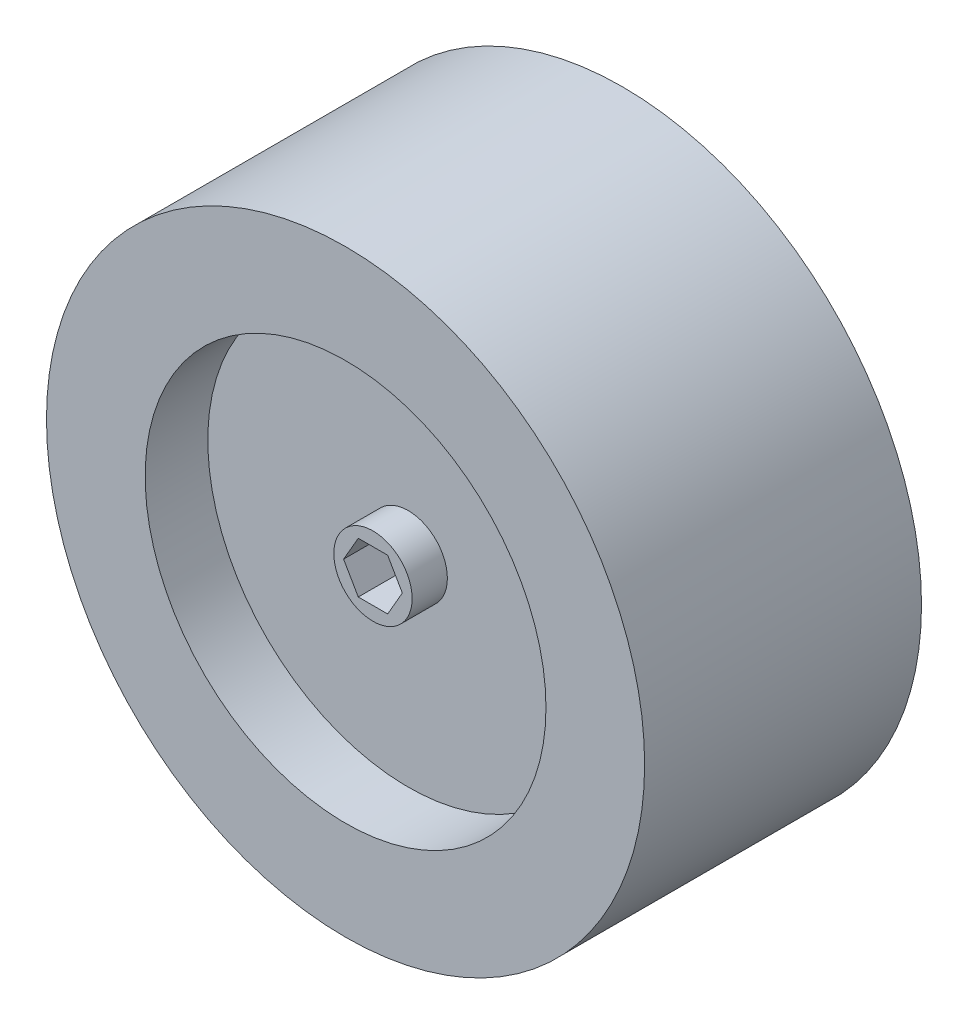
ISO-10303-21;
HEADER;
FILE_DESCRIPTION(('STEP AP214'),'2;1');
FILE_NAME('part.step','',(''),(''),'','','');
FILE_SCHEMA(('AUTOMOTIVE_DESIGN { 1 0 10303 214 1 1 1 1 }'));
ENDSEC;
DATA;
#1=APPLICATION_CONTEXT('core data for automotive mechanical design processes');
#2=APPLICATION_PROTOCOL_DEFINITION('international standard','automotive_design',2000,#1);
#3=PRODUCT_CONTEXT('',#1,'mechanical');
#4=PRODUCT('Part','Part','',(#3));
#5=PRODUCT_RELATED_PRODUCT_CATEGORY('part','',(#4));
#6=PRODUCT_DEFINITION_FORMATION('','',#4);
#7=PRODUCT_DEFINITION_CONTEXT('part definition',#1,'design');
#8=PRODUCT_DEFINITION('design','',#6,#7);
#9=PRODUCT_DEFINITION_SHAPE('','',#8);
#10=(LENGTH_UNIT() NAMED_UNIT(*) SI_UNIT(.MILLI.,.METRE.));
#11=(NAMED_UNIT(*) PLANE_ANGLE_UNIT() SI_UNIT($,.RADIAN.));
#12=(NAMED_UNIT(*) SI_UNIT($,.STERADIAN.) SOLID_ANGLE_UNIT());
#13=UNCERTAINTY_MEASURE_WITH_UNIT(LENGTH_MEASURE(1.E-05),#10,'distance_accuracy_value','');
#14=(GEOMETRIC_REPRESENTATION_CONTEXT(3) GLOBAL_UNCERTAINTY_ASSIGNED_CONTEXT((#13)) GLOBAL_UNIT_ASSIGNED_CONTEXT((#10,
#11,#12)) REPRESENTATION_CONTEXT('',''));
#15=CARTESIAN_POINT('',(0.,0.,0.));
#16=DIRECTION('',(0.,0.,1.));
#17=DIRECTION('',(1.,0.,0.));
#18=AXIS2_PLACEMENT_3D('',#15,#16,#17);
#19=CARTESIAN_POINT('',(0.,0.,-14.195));
#20=DIRECTION('',(0.,0.,-1.));
#21=DIRECTION('',(-1.,0.,0.));
#22=AXIS2_PLACEMENT_3D('',#19,#20,#21);
#23=CYLINDRICAL_SURFACE('',#22,3.81);
#24=CARTESIAN_POINT('',(0.,0.,-14.195));
#25=DIRECTION('',(0.,0.,-1.));
#26=DIRECTION('',(-1.,0.,0.));
#27=AXIS2_PLACEMENT_3D('',#24,#25,#26);
#28=CIRCLE('',#27,3.81);
#29=CARTESIAN_POINT('',(-3.81,0.,-14.195));
#30=VERTEX_POINT('',#29);
#31=EDGE_CURVE('E197',#30,#30,#28,.T.);
#32=ORIENTED_EDGE('',*,*,#31,.F.);
#33=EDGE_LOOP('',(#32));
#34=FACE_BOUND('',#33,.T.);
#35=CARTESIAN_POINT('',(0.,0.,-19.275));
#36=DIRECTION('',(0.,0.,-1.));
#37=DIRECTION('',(-1.,0.,0.));
#38=AXIS2_PLACEMENT_3D('',#35,#36,#37);
#39=CIRCLE('',#38,3.81);
#40=CARTESIAN_POINT('',(-3.81,0.,-19.275));
#41=VERTEX_POINT('',#40);
#42=EDGE_CURVE('E47',#41,#41,#39,.F.);
#43=ORIENTED_EDGE('',*,*,#42,.F.);
#44=EDGE_LOOP('',(#43));
#45=FACE_BOUND('',#44,.T.);
#46=ADVANCED_FACE('F43',(#34,#45),#23,.F.);
#47=CARTESIAN_POINT('',(0.,0.,-9.81));
#48=DIRECTION('',(0.,0.,1.));
#49=DIRECTION('',(1.,0.,0.));
#50=AXIS2_PLACEMENT_3D('',#47,#48,#49);
#51=CYLINDRICAL_SURFACE('',#50,2.75);
#52=CARTESIAN_POINT('',(0.,0.,-9.835));
#53=DIRECTION('',(0.,0.,1.));
#54=DIRECTION('',(1.,0.,0.));
#55=AXIS2_PLACEMENT_3D('',#52,#53,#54);
#56=CIRCLE('',#55,2.75);
#57=CARTESIAN_POINT('',(2.75,0.,-9.835));
#58=VERTEX_POINT('',#57);
#59=EDGE_CURVE('E122',#58,#58,#56,.T.);
#60=ORIENTED_EDGE('',*,*,#59,.T.);
#61=EDGE_LOOP('',(#60));
#62=FACE_BOUND('',#61,.T.);
#63=CARTESIAN_POINT('',(0.,0.,-14.195));
#64=DIRECTION('',(0.,0.,-1.));
#65=DIRECTION('',(-1.,0.,0.));
#66=AXIS2_PLACEMENT_3D('',#63,#64,#65);
#67=CIRCLE('',#66,2.75);
#68=CARTESIAN_POINT('',(-2.75,0.,-14.195));
#69=VERTEX_POINT('',#68);
#70=EDGE_CURVE('E194',#69,#69,#67,.F.);
#71=ORIENTED_EDGE('',*,*,#70,.F.);
#72=EDGE_LOOP('',(#71));
#73=FACE_BOUND('',#72,.T.);
#74=ADVANCED_FACE('F244',(#62,#73),#51,.F.);
#75=CARTESIAN_POINT('',(0.,0.,18.005));
#76=DIRECTION('',(0.,0.,1.));
#77=DIRECTION('',(1.,0.,0.));
#78=AXIS2_PLACEMENT_3D('',#75,#76,#77);
#79=PLANE('',#78);
#80=CARTESIAN_POINT('',(0.,0.,18.005));
#81=DIRECTION('',(0.,0.,1.));
#82=DIRECTION('',(1.,0.,0.));
#83=AXIS2_PLACEMENT_3D('',#80,#81,#82);
#84=CIRCLE('',#83,6.35);
#85=CARTESIAN_POINT('',(6.35,0.,18.005));
#86=VERTEX_POINT('',#85);
#87=EDGE_CURVE('E154',#86,#86,#84,.T.);
#88=ORIENTED_EDGE('',*,*,#87,.T.);
#89=EDGE_LOOP('',(#88));
#90=FACE_BOUND('',#89,.T.);
#91=DIRECTION('',(1.,0.,0.));
#92=VECTOR('',#91,1.);
#93=CARTESIAN_POINT('',(0.,4.125,18.005));
#94=LINE('',#93,#92);
#95=CARTESIAN_POINT('',(-2.38156986040721,4.125,18.005));
#96=VERTEX_POINT('',#95);
#97=CARTESIAN_POINT('',(2.3815698604072,4.125,18.005));
#98=VERTEX_POINT('',#97);
#99=EDGE_CURVE('E53',#96,#98,#94,.T.);
#100=ORIENTED_EDGE('',*,*,#99,.T.);
#101=DIRECTION('',(0.5,-0.866025403784439,0.));
#102=VECTOR('',#101,1.);
#103=CARTESIAN_POINT('',(3.57235479061081,2.0625,18.005));
#104=LINE('',#103,#102);
#105=CARTESIAN_POINT('',(4.76313972081441,0.,18.005));
#106=VERTEX_POINT('',#105);
#107=EDGE_CURVE('E11',#98,#106,#104,.T.);
#108=ORIENTED_EDGE('',*,*,#107,.T.);
#109=DIRECTION('',(-0.5,-0.866025403784439,0.));
#110=VECTOR('',#109,1.);
#111=CARTESIAN_POINT('',(3.57235479061081,-2.0625,18.005));
#112=LINE('',#111,#110);
#113=CARTESIAN_POINT('',(2.3815698604072,-4.125,18.005));
#114=VERTEX_POINT('',#113);
#115=EDGE_CURVE('E174',#106,#114,#112,.T.);
#116=ORIENTED_EDGE('',*,*,#115,.T.);
#117=DIRECTION('',(-1.,0.,0.));
#118=VECTOR('',#117,1.);
#119=CARTESIAN_POINT('',(0.,-4.125,18.005));
#120=LINE('',#119,#118);
#121=CARTESIAN_POINT('',(-2.38156986040721,-4.125,18.005));
#122=VERTEX_POINT('',#121);
#123=EDGE_CURVE('E181',#114,#122,#120,.T.);
#124=ORIENTED_EDGE('',*,*,#123,.T.);
#125=DIRECTION('',(-0.5,0.866025403784439,0.));
#126=VECTOR('',#125,1.);
#127=CARTESIAN_POINT('',(-3.57235479061081,-2.0625,18.005));
#128=LINE('',#127,#126);
#129=CARTESIAN_POINT('',(-4.76313972081441,0.,18.005));
#130=VERTEX_POINT('',#129);
#131=EDGE_CURVE('E185',#122,#130,#128,.T.);
#132=ORIENTED_EDGE('',*,*,#131,.T.);
#133=DIRECTION('',(0.5,0.866025403784439,0.));
#134=VECTOR('',#133,1.);
#135=CARTESIAN_POINT('',(-3.57235479061081,2.0625,18.005));
#136=LINE('',#135,#134);
#137=EDGE_CURVE('E189',#130,#96,#136,.T.);
#138=ORIENTED_EDGE('',*,*,#137,.T.);
#139=EDGE_LOOP('',(#100,#108,#116,#124,#132,#138));
#140=FACE_BOUND('',#139,.T.);
#141=ADVANCED_FACE('F236',(#90,#140),#79,.T.);
#142=CARTESIAN_POINT('',(0.,0.,22.45));
#143=DIRECTION('',(0.,0.,-1.));
#144=DIRECTION('',(-1.,0.,0.));
#145=AXIS2_PLACEMENT_3D('',#142,#143,#144);
#146=CYLINDRICAL_SURFACE('',#145,48.5);
#147=CARTESIAN_POINT('',(0.,0.,22.45));
#148=DIRECTION('',(0.,0.,1.));
#149=DIRECTION('',(1.,0.,0.));
#150=AXIS2_PLACEMENT_3D('',#147,#148,#149);
#151=CIRCLE('',#150,48.5);
#152=CARTESIAN_POINT('',(48.5,0.,22.45));
#153=VERTEX_POINT('',#152);
#154=EDGE_CURVE('E170',#153,#153,#151,.T.);
#155=ORIENTED_EDGE('',*,*,#154,.F.);
#156=EDGE_LOOP('',(#155));
#157=FACE_BOUND('',#156,.T.);
#158=CARTESIAN_POINT('',(0.,0.,-22.45));
#159=DIRECTION('',(0.,0.,1.));
#160=DIRECTION('',(1.,0.,0.));
#161=AXIS2_PLACEMENT_3D('',#158,#159,#160);
#162=CIRCLE('',#161,48.5);
#163=CARTESIAN_POINT('',(48.5,0.,-22.45));
#164=VERTEX_POINT('',#163);
#165=EDGE_CURVE('E166',#164,#164,#162,.T.);
#166=ORIENTED_EDGE('',*,*,#165,.T.);
#167=EDGE_LOOP('',(#166));
#168=FACE_BOUND('',#167,.T.);
#169=ADVANCED_FACE('F45',(#157,#168),#146,.T.);
#170=CARTESIAN_POINT('',(0.,0.,22.45));
#171=DIRECTION('',(0.,0.,1.));
#172=DIRECTION('',(1.,0.,0.));
#173=AXIS2_PLACEMENT_3D('',#170,#171,#172);
#174=PLANE('',#173);
#175=CARTESIAN_POINT('',(0.,0.,22.45));
#176=DIRECTION('',(0.,0.,1.));
#177=DIRECTION('',(1.,0.,0.));
#178=AXIS2_PLACEMENT_3D('',#175,#176,#177);
#179=CIRCLE('',#178,32.5);
#180=CARTESIAN_POINT('',(32.5,0.,22.45));
#181=VERTEX_POINT('',#180);
#182=EDGE_CURVE('E158',#181,#181,#179,.T.);
#183=ORIENTED_EDGE('',*,*,#182,.F.);
#184=EDGE_LOOP('',(#183));
#185=FACE_BOUND('',#184,.T.);
#186=ORIENTED_EDGE('',*,*,#154,.T.);
#187=EDGE_LOOP('',(#186));
#188=FACE_BOUND('',#187,.T.);
#189=ADVANCED_FACE('F232',(#185,#188),#174,.T.);
#190=CARTESIAN_POINT('',(0.,0.,-22.45));
#191=DIRECTION('',(0.,0.,1.));
#192=DIRECTION('',(1.,0.,0.));
#193=AXIS2_PLACEMENT_3D('',#190,#191,#192);
#194=PLANE('',#193);
#195=CARTESIAN_POINT('',(0.,0.,-22.45));
#196=DIRECTION('',(0.,0.,-1.));
#197=DIRECTION('',(-1.,0.,0.));
#198=AXIS2_PLACEMENT_3D('',#195,#196,#197);
#199=CIRCLE('',#198,25.4);
#200=CARTESIAN_POINT('',(-25.4,0.,-22.45));
#201=VERTEX_POINT('',#200);
#202=EDGE_CURVE('E211',#201,#201,#199,.T.);
#203=ORIENTED_EDGE('',*,*,#202,.F.);
#204=EDGE_LOOP('',(#203));
#205=FACE_BOUND('',#204,.T.);
#206=ORIENTED_EDGE('',*,*,#165,.F.);
#207=EDGE_LOOP('',(#206));
#208=FACE_BOUND('',#207,.T.);
#209=ADVANCED_FACE('F228',(#205,#208),#194,.F.);
#210=CARTESIAN_POINT('',(0.,0.,12.29));
#211=DIRECTION('',(0.,0.,1.));
#212=DIRECTION('',(1.,0.,0.));
#213=AXIS2_PLACEMENT_3D('',#210,#211,#212);
#214=CYLINDRICAL_SURFACE('',#213,32.5);
#215=CARTESIAN_POINT('',(0.,0.,12.29));
#216=DIRECTION('',(0.,0.,1.));
#217=DIRECTION('',(1.,0.,0.));
#218=AXIS2_PLACEMENT_3D('',#215,#216,#217);
#219=CIRCLE('',#218,32.5);
#220=CARTESIAN_POINT('',(32.5,0.,12.29));
#221=VERTEX_POINT('',#220);
#222=EDGE_CURVE('E162',#221,#221,#219,.T.);
#223=ORIENTED_EDGE('',*,*,#222,.F.);
#224=EDGE_LOOP('',(#223));
#225=FACE_BOUND('',#224,.T.);
#226=ORIENTED_EDGE('',*,*,#182,.T.);
#227=EDGE_LOOP('',(#226));
#228=FACE_BOUND('',#227,.T.);
#229=ADVANCED_FACE('F231',(#225,#228),#214,.F.);
#230=CARTESIAN_POINT('',(0.,0.,12.29));
#231=DIRECTION('',(0.,0.,1.));
#232=DIRECTION('',(1.,0.,0.));
#233=AXIS2_PLACEMENT_3D('',#230,#231,#232);
#234=PLANE('',#233);
#235=CARTESIAN_POINT('',(0.,0.,12.29));
#236=DIRECTION('',(0.,0.,1.));
#237=DIRECTION('',(1.,0.,0.));
#238=AXIS2_PLACEMENT_3D('',#235,#236,#237);
#239=CIRCLE('',#238,6.35);
#240=CARTESIAN_POINT('',(6.35,0.,12.29));
#241=VERTEX_POINT('',#240);
#242=EDGE_CURVE('E105',#241,#241,#239,.T.);
#243=ORIENTED_EDGE('',*,*,#242,.F.);
#244=EDGE_LOOP('',(#243));
#245=FACE_BOUND('',#244,.T.);
#246=ORIENTED_EDGE('',*,*,#222,.T.);
#247=EDGE_LOOP('',(#246));
#248=FACE_BOUND('',#247,.T.);
#249=ADVANCED_FACE('F289',(#245,#248),#234,.T.);
#250=CARTESIAN_POINT('',(0.,0.,18.005));
#251=DIRECTION('',(0.,0.,-1.));
#252=DIRECTION('',(-1.,0.,0.));
#253=AXIS2_PLACEMENT_3D('',#250,#251,#252);
#254=CYLINDRICAL_SURFACE('',#253,6.35);
#255=ORIENTED_EDGE('',*,*,#87,.F.);
#256=EDGE_LOOP('',(#255));
#257=FACE_BOUND('',#256,.T.);
#258=ORIENTED_EDGE('',*,*,#242,.T.);
#259=EDGE_LOOP('',(#258));
#260=FACE_BOUND('',#259,.T.);
#261=ADVANCED_FACE('F285',(#257,#260),#254,.T.);
#262=CARTESIAN_POINT('',(4.76313972081441,0.,22.45));
#263=DIRECTION('',(-0.866025403784438,-0.5,0.));
#264=DIRECTION('',(0.5,-0.866025403784439,0.));
#265=AXIS2_PLACEMENT_3D('',#262,#263,#264);
#266=PLANE('',#265);
#267=DIRECTION('',(0.,0.,-1.));
#268=VECTOR('',#267,1.);
#269=CARTESIAN_POINT('',(2.3815698604072,4.125,22.45));
#270=LINE('',#269,#268);
#271=CARTESIAN_POINT('',(2.3815698604072,4.125,-9.81));
#272=VERTEX_POINT('',#271);
#273=EDGE_CURVE('E96',#98,#272,#270,.T.);
#274=ORIENTED_EDGE('',*,*,#273,.T.);
#275=DIRECTION('',(-0.5,0.866025403784439,0.));
#276=VECTOR('',#275,1.);
#277=CARTESIAN_POINT('',(4.76313972081441,0.,-9.81));
#278=LINE('',#277,#276);
#279=CARTESIAN_POINT('',(4.76313972081441,0.,-9.81));
#280=VERTEX_POINT('',#279);
#281=EDGE_CURVE('E100',#280,#272,#278,.T.);
#282=ORIENTED_EDGE('',*,*,#281,.F.);
#283=DIRECTION('',(0.,0.,-1.));
#284=VECTOR('',#283,1.);
#285=CARTESIAN_POINT('',(4.76313972081441,0.,22.45));
#286=LINE('',#285,#284);
#287=EDGE_CURVE('E141',#106,#280,#286,.T.);
#288=ORIENTED_EDGE('',*,*,#287,.F.);
#289=ORIENTED_EDGE('',*,*,#107,.F.);
#290=EDGE_LOOP('',(#274,#282,#288,#289));
#291=FACE_BOUND('',#290,.T.);
#292=ADVANCED_FACE('F98',(#291),#266,.T.);
#293=CARTESIAN_POINT('',(2.3815698604072,4.125,22.45));
#294=DIRECTION('',(0.,-1.,0.));
#295=DIRECTION('',(1.,0.,0.));
#296=AXIS2_PLACEMENT_3D('',#293,#294,#295);
#297=PLANE('',#296);
#298=DIRECTION('',(0.,0.,-1.));
#299=VECTOR('',#298,1.);
#300=CARTESIAN_POINT('',(-2.38156986040721,4.125,22.45));
#301=LINE('',#300,#299);
#302=CARTESIAN_POINT('',(-2.38156986040721,4.125,-9.81));
#303=VERTEX_POINT('',#302);
#304=EDGE_CURVE('E106',#96,#303,#301,.T.);
#305=ORIENTED_EDGE('',*,*,#304,.T.);
#306=DIRECTION('',(-1.,0.,0.));
#307=VECTOR('',#306,1.);
#308=CARTESIAN_POINT('',(2.3815698604072,4.125,-9.81));
#309=LINE('',#308,#307);
#310=EDGE_CURVE('E109',#272,#303,#309,.T.);
#311=ORIENTED_EDGE('',*,*,#310,.F.);
#312=ORIENTED_EDGE('',*,*,#273,.F.);
#313=ORIENTED_EDGE('',*,*,#99,.F.);
#314=EDGE_LOOP('',(#305,#311,#312,#313));
#315=FACE_BOUND('',#314,.T.);
#316=ADVANCED_FACE('F110',(#315),#297,.T.);
#317=CARTESIAN_POINT('',(-2.38156986040721,4.125,22.45));
#318=DIRECTION('',(0.866025403784439,-0.5,0.));
#319=DIRECTION('',(0.5,0.866025403784439,0.));
#320=AXIS2_PLACEMENT_3D('',#317,#318,#319);
#321=PLANE('',#320);
#322=DIRECTION('',(0.,0.,-1.));
#323=VECTOR('',#322,1.);
#324=CARTESIAN_POINT('',(-4.76313972081441,0.,22.45));
#325=LINE('',#324,#323);
#326=CARTESIAN_POINT('',(-4.76313972081441,0.,-9.81));
#327=VERTEX_POINT('',#326);
#328=EDGE_CURVE('E149',#130,#327,#325,.T.);
#329=ORIENTED_EDGE('',*,*,#328,.T.);
#330=DIRECTION('',(-0.5,-0.866025403784439,0.));
#331=VECTOR('',#330,1.);
#332=CARTESIAN_POINT('',(-2.38156986040721,4.125,-9.81));
#333=LINE('',#332,#331);
#334=EDGE_CURVE('E116',#303,#327,#333,.T.);
#335=ORIENTED_EDGE('',*,*,#334,.F.);
#336=ORIENTED_EDGE('',*,*,#304,.F.);
#337=ORIENTED_EDGE('',*,*,#137,.F.);
#338=EDGE_LOOP('',(#329,#335,#336,#337));
#339=FACE_BOUND('',#338,.T.);
#340=ADVANCED_FACE('F277',(#339),#321,.T.);
#341=CARTESIAN_POINT('',(-4.76313972081441,0.,22.45));
#342=DIRECTION('',(0.866025403784439,0.5,0.));
#343=DIRECTION('',(-0.5,0.866025403784439,0.));
#344=AXIS2_PLACEMENT_3D('',#341,#342,#343);
#345=PLANE('',#344);
#346=DIRECTION('',(0.,0.,-1.));
#347=VECTOR('',#346,1.);
#348=CARTESIAN_POINT('',(-2.38156986040721,-4.125,22.45));
#349=LINE('',#348,#347);
#350=CARTESIAN_POINT('',(-2.38156986040721,-4.125,-9.81));
#351=VERTEX_POINT('',#350);
#352=EDGE_CURVE('E146',#122,#351,#349,.T.);
#353=ORIENTED_EDGE('',*,*,#352,.T.);
#354=DIRECTION('',(0.5,-0.866025403784439,0.));
#355=VECTOR('',#354,1.);
#356=CARTESIAN_POINT('',(-4.76313972081441,0.,-9.81));
#357=LINE('',#356,#355);
#358=EDGE_CURVE('E132',#327,#351,#357,.T.);
#359=ORIENTED_EDGE('',*,*,#358,.F.);
#360=ORIENTED_EDGE('',*,*,#328,.F.);
#361=ORIENTED_EDGE('',*,*,#131,.F.);
#362=EDGE_LOOP('',(#353,#359,#360,#361));
#363=FACE_BOUND('',#362,.T.);
#364=ADVANCED_FACE('F273',(#363),#345,.T.);
#365=CARTESIAN_POINT('',(-2.38156986040721,-4.125,22.45));
#366=DIRECTION('',(0.,1.,0.));
#367=DIRECTION('',(0.,0.,1.));
#368=AXIS2_PLACEMENT_3D('',#365,#366,#367);
#369=PLANE('',#368);
#370=DIRECTION('',(0.,0.,-1.));
#371=VECTOR('',#370,1.);
#372=CARTESIAN_POINT('',(2.3815698604072,-4.125,22.45));
#373=LINE('',#372,#371);
#374=CARTESIAN_POINT('',(2.3815698604072,-4.125,-9.81));
#375=VERTEX_POINT('',#374);
#376=EDGE_CURVE('E61',#114,#375,#373,.T.);
#377=ORIENTED_EDGE('',*,*,#376,.T.);
#378=DIRECTION('',(1.,0.,0.));
#379=VECTOR('',#378,1.);
#380=CARTESIAN_POINT('',(-2.38156986040721,-4.125,-9.81));
#381=LINE('',#380,#379);
#382=EDGE_CURVE('E136',#351,#375,#381,.T.);
#383=ORIENTED_EDGE('',*,*,#382,.F.);
#384=ORIENTED_EDGE('',*,*,#352,.F.);
#385=ORIENTED_EDGE('',*,*,#123,.F.);
#386=EDGE_LOOP('',(#377,#383,#384,#385));
#387=FACE_BOUND('',#386,.T.);
#388=ADVANCED_FACE('F270',(#387),#369,.T.);
#389=CARTESIAN_POINT('',(2.3815698604072,-4.125,22.45));
#390=DIRECTION('',(-0.866025403784439,0.5,0.));
#391=DIRECTION('',(-0.5,-0.866025403784439,0.));
#392=AXIS2_PLACEMENT_3D('',#389,#390,#391);
#393=PLANE('',#392);
#394=ORIENTED_EDGE('',*,*,#287,.T.);
#395=DIRECTION('',(0.5,0.866025403784439,0.));
#396=VECTOR('',#395,1.);
#397=CARTESIAN_POINT('',(2.3815698604072,-4.125,-9.81));
#398=LINE('',#397,#396);
#399=EDGE_CURVE('E120',#375,#280,#398,.T.);
#400=ORIENTED_EDGE('',*,*,#399,.F.);
#401=ORIENTED_EDGE('',*,*,#376,.F.);
#402=ORIENTED_EDGE('',*,*,#115,.F.);
#403=EDGE_LOOP('',(#394,#400,#401,#402));
#404=FACE_BOUND('',#403,.T.);
#405=ADVANCED_FACE('F266',(#404),#393,.T.);
#406=CARTESIAN_POINT('',(0.,0.,-9.81));
#407=DIRECTION('',(0.,0.,1.));
#408=DIRECTION('',(1.,0.,0.));
#409=AXIS2_PLACEMENT_3D('',#406,#407,#408);
#410=PLANE('',#409);
#411=CARTESIAN_POINT('',(0.,0.,-9.81));
#412=DIRECTION('',(0.,0.,1.));
#413=DIRECTION('',(1.,0.,0.));
#414=AXIS2_PLACEMENT_3D('',#411,#412,#413);
#415=CIRCLE('',#414,2.775);
#416=CARTESIAN_POINT('',(2.775,0.,-9.81));
#417=VERTEX_POINT('',#416);
#418=EDGE_CURVE('E126',#417,#417,#415,.T.);
#419=ORIENTED_EDGE('',*,*,#418,.F.);
#420=EDGE_LOOP('',(#419));
#421=FACE_BOUND('',#420,.T.);
#422=ORIENTED_EDGE('',*,*,#281,.T.);
#423=ORIENTED_EDGE('',*,*,#310,.T.);
#424=ORIENTED_EDGE('',*,*,#334,.T.);
#425=ORIENTED_EDGE('',*,*,#358,.T.);
#426=ORIENTED_EDGE('',*,*,#382,.T.);
#427=ORIENTED_EDGE('',*,*,#399,.T.);
#428=EDGE_LOOP('',(#422,#423,#424,#425,#426,#427));
#429=FACE_BOUND('',#428,.T.);
#430=ADVANCED_FACE('F118',(#421,#429),#410,.T.);
#431=CARTESIAN_POINT('',(0.,0.,-9.81));
#432=DIRECTION('',(0.,0.,1.));
#433=DIRECTION('',(1.,0.,0.));
#434=AXIS2_PLACEMENT_3D('',#431,#432,#433);
#435=CONICAL_SURFACE('',#434,2.775,0.785398163397483);
#436=ORIENTED_EDGE('',*,*,#59,.F.);
#437=EDGE_LOOP('',(#436));
#438=FACE_BOUND('',#437,.T.);
#439=ORIENTED_EDGE('',*,*,#418,.T.);
#440=EDGE_LOOP('',(#439));
#441=FACE_BOUND('',#440,.T.);
#442=ADVANCED_FACE('F260',(#438,#441),#435,.F.);
#443=CARTESIAN_POINT('',(0.,0.,-14.195));
#444=DIRECTION('',(0.,0.,-1.));
#445=DIRECTION('',(-1.,0.,0.));
#446=AXIS2_PLACEMENT_3D('',#443,#444,#445);
#447=PLANE('',#446);
#448=ORIENTED_EDGE('',*,*,#31,.T.);
#449=EDGE_LOOP('',(#448));
#450=FACE_BOUND('',#449,.T.);
#451=ORIENTED_EDGE('',*,*,#70,.T.);
#452=EDGE_LOOP('',(#451));
#453=FACE_BOUND('',#452,.T.);
#454=ADVANCED_FACE('F259',(#450,#453),#447,.T.);
#455=CARTESIAN_POINT('',(0.,0.,-19.275));
#456=DIRECTION('',(0.,0.,-1.));
#457=DIRECTION('',(-1.,0.,0.));
#458=AXIS2_PLACEMENT_3D('',#455,#456,#457);
#459=PLANE('',#458);
#460=CARTESIAN_POINT('',(0.,0.,-19.275));
#461=DIRECTION('',(0.,0.,-1.));
#462=DIRECTION('',(-1.,0.,0.));
#463=AXIS2_PLACEMENT_3D('',#460,#461,#462);
#464=CIRCLE('',#463,25.4);
#465=CARTESIAN_POINT('',(-25.4,0.,-19.275));
#466=VERTEX_POINT('',#465);
#467=EDGE_CURVE('E209',#466,#466,#464,.T.);
#468=ORIENTED_EDGE('',*,*,#467,.T.);
#469=EDGE_LOOP('',(#468));
#470=FACE_BOUND('',#469,.T.);
#471=ORIENTED_EDGE('',*,*,#42,.T.);
#472=EDGE_LOOP('',(#471));
#473=FACE_BOUND('',#472,.T.);
#474=ADVANCED_FACE('F219',(#470,#473),#459,.T.);
#475=CARTESIAN_POINT('',(0.,0.,-19.275));
#476=DIRECTION('',(0.,0.,-1.));
#477=DIRECTION('',(-1.,0.,0.));
#478=AXIS2_PLACEMENT_3D('',#475,#476,#477);
#479=CYLINDRICAL_SURFACE('',#478,25.4);
#480=ORIENTED_EDGE('',*,*,#467,.F.);
#481=EDGE_LOOP('',(#480));
#482=FACE_BOUND('',#481,.T.);
#483=ORIENTED_EDGE('',*,*,#202,.T.);
#484=EDGE_LOOP('',(#483));
#485=FACE_BOUND('',#484,.T.);
#486=ADVANCED_FACE('F222',(#482,#485),#479,.F.);
#487=CLOSED_SHELL('',(#46,#74,#141,#169,#189,#209,#229,#249,#261,#292,#316,#340,#364,#388,#405,
#430,#442,#454,#474,#486));
#488=MANIFOLD_SOLID_BREP('B2',#487);
#489=ADVANCED_BREP_SHAPE_REPRESENTATION('',(#18,#488),#14);
#490=SHAPE_DEFINITION_REPRESENTATION(#9,#489);
ENDSEC;
END-ISO-10303-21;
